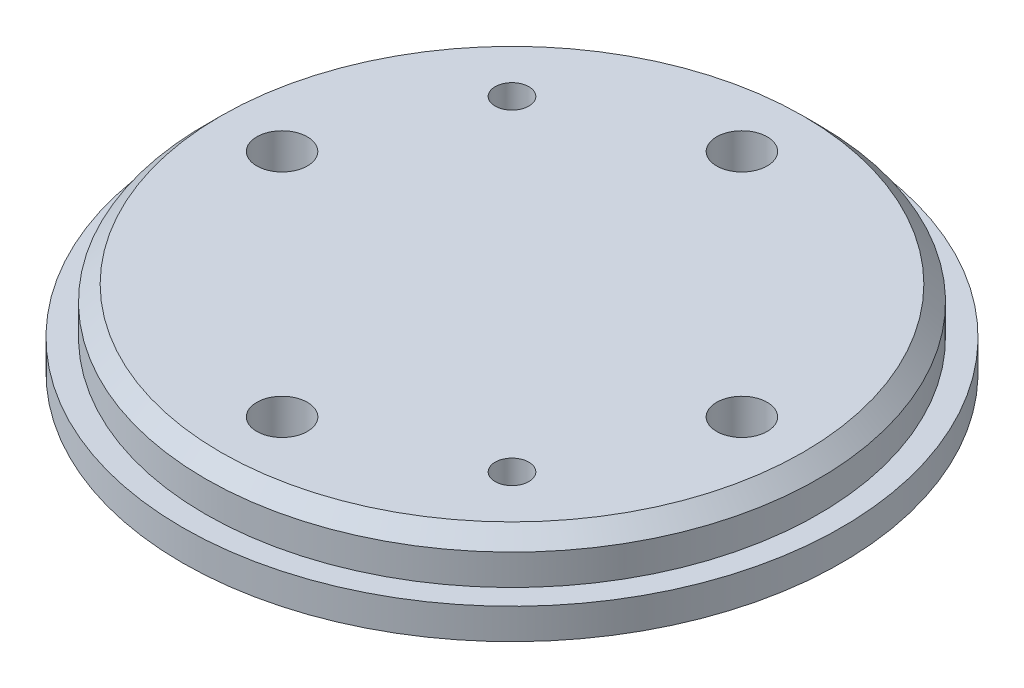
ISO-10303-21;
HEADER;
FILE_DESCRIPTION(('STEP AP214'),'2;1');
FILE_NAME('part.step','',(''),(''),'','','');
FILE_SCHEMA(('AUTOMOTIVE_DESIGN { 1 0 10303 214 1 1 1 1 }'));
ENDSEC;
DATA;
#1=APPLICATION_CONTEXT('core data for automotive mechanical design processes');
#2=APPLICATION_PROTOCOL_DEFINITION('international standard','automotive_design',2000,#1);
#3=PRODUCT_CONTEXT('',#1,'mechanical');
#4=PRODUCT('Part','Part','',(#3));
#5=PRODUCT_RELATED_PRODUCT_CATEGORY('part','',(#4));
#6=PRODUCT_DEFINITION_FORMATION('','',#4);
#7=PRODUCT_DEFINITION_CONTEXT('part definition',#1,'design');
#8=PRODUCT_DEFINITION('design','',#6,#7);
#9=PRODUCT_DEFINITION_SHAPE('','',#8);
#10=(LENGTH_UNIT() NAMED_UNIT(*) SI_UNIT(.MILLI.,.METRE.));
#11=(NAMED_UNIT(*) PLANE_ANGLE_UNIT() SI_UNIT($,.RADIAN.));
#12=(NAMED_UNIT(*) SI_UNIT($,.STERADIAN.) SOLID_ANGLE_UNIT());
#13=UNCERTAINTY_MEASURE_WITH_UNIT(LENGTH_MEASURE(1.E-05),#10,'distance_accuracy_value','');
#14=(GEOMETRIC_REPRESENTATION_CONTEXT(3) GLOBAL_UNCERTAINTY_ASSIGNED_CONTEXT((#13)) GLOBAL_UNIT_ASSIGNED_CONTEXT((#10,
#11,#12)) REPRESENTATION_CONTEXT('',''));
#15=CARTESIAN_POINT('',(0.,0.,0.));
#16=DIRECTION('',(0.,0.,1.));
#17=DIRECTION('',(1.,0.,0.));
#18=AXIS2_PLACEMENT_3D('',#15,#16,#17);
#19=CARTESIAN_POINT('',(10.6066017177982,0.,10.6066017177983));
#20=DIRECTION('',(0.,1.,0.));
#21=DIRECTION('',(0.,0.,1.));
#22=AXIS2_PLACEMENT_3D('',#19,#20,#21);
#23=CYLINDRICAL_SURFACE('',#22,1.1);
#24=CARTESIAN_POINT('',(10.6066017177982,3.,10.6066017177983));
#25=DIRECTION('',(0.,-1.,0.));
#26=DIRECTION('',(0.,0.,-1.));
#27=AXIS2_PLACEMENT_3D('',#24,#25,#26);
#28=CIRCLE('',#27,1.1);
#29=CARTESIAN_POINT('',(10.6066017177982,3.,9.50660171779826));
#30=VERTEX_POINT('',#29);
#31=EDGE_CURVE('E10',#30,#30,#28,.T.);
#32=ORIENTED_EDGE('',*,*,#31,.T.);
#33=EDGE_LOOP('',(#32));
#34=FACE_BOUND('',#33,.T.);
#35=CARTESIAN_POINT('',(10.6066017177982,5.,10.6066017177983));
#36=DIRECTION('',(0.,1.,0.));
#37=DIRECTION('',(0.,0.,-1.));
#38=AXIS2_PLACEMENT_3D('',#35,#36,#37);
#39=CIRCLE('',#38,1.1);
#40=CARTESIAN_POINT('',(10.6066017177982,5.,9.50660171779826));
#41=VERTEX_POINT('',#40);
#42=EDGE_CURVE('E111',#41,#41,#39,.T.);
#43=ORIENTED_EDGE('',*,*,#42,.T.);
#44=EDGE_LOOP('',(#43));
#45=FACE_BOUND('',#44,.T.);
#46=ADVANCED_FACE('F39',(#34,#45),#23,.F.);
#47=CARTESIAN_POINT('',(-10.6066017177982,0.,-10.6066017177983));
#48=DIRECTION('',(0.,1.,0.));
#49=DIRECTION('',(0.,0.,1.));
#50=AXIS2_PLACEMENT_3D('',#47,#48,#49);
#51=CYLINDRICAL_SURFACE('',#50,1.1);
#52=CARTESIAN_POINT('',(-10.6066017177982,3.,-10.6066017177983));
#53=DIRECTION('',(0.,-1.,0.));
#54=DIRECTION('',(0.,0.,-1.));
#55=AXIS2_PLACEMENT_3D('',#52,#53,#54);
#56=CIRCLE('',#55,1.1);
#57=CARTESIAN_POINT('',(-10.6066017177982,3.,-11.7066017177983));
#58=VERTEX_POINT('',#57);
#59=EDGE_CURVE('E46',#58,#58,#56,.T.);
#60=ORIENTED_EDGE('',*,*,#59,.T.);
#61=EDGE_LOOP('',(#60));
#62=FACE_BOUND('',#61,.T.);
#63=CARTESIAN_POINT('',(-10.6066017177982,5.,-10.6066017177983));
#64=DIRECTION('',(0.,1.,0.));
#65=DIRECTION('',(0.,0.,1.));
#66=AXIS2_PLACEMENT_3D('',#63,#64,#65);
#67=CIRCLE('',#66,1.1);
#68=CARTESIAN_POINT('',(-10.6066017177982,5.,-9.50660171779826));
#69=VERTEX_POINT('',#68);
#70=EDGE_CURVE('E100',#69,#69,#67,.T.);
#71=ORIENTED_EDGE('',*,*,#70,.T.);
#72=EDGE_LOOP('',(#71));
#73=FACE_BOUND('',#72,.T.);
#74=ADVANCED_FACE('F151',(#62,#73),#51,.F.);
#75=CARTESIAN_POINT('',(0.,2.,0.));
#76=DIRECTION('',(0.,-1.,0.));
#77=DIRECTION('',(0.,0.,-1.));
#78=AXIS2_PLACEMENT_3D('',#75,#76,#77);
#79=CYLINDRICAL_SURFACE('',#78,21.5);
#80=CARTESIAN_POINT('',(0.,2.,0.));
#81=DIRECTION('',(0.,1.,0.));
#82=DIRECTION('',(0.,0.,1.));
#83=AXIS2_PLACEMENT_3D('',#80,#81,#82);
#84=CIRCLE('',#83,21.5);
#85=CARTESIAN_POINT('',(0.,2.,21.5));
#86=VERTEX_POINT('',#85);
#87=EDGE_CURVE('E87',#86,#86,#84,.T.);
#88=ORIENTED_EDGE('',*,*,#87,.F.);
#89=EDGE_LOOP('',(#88));
#90=FACE_BOUND('',#89,.T.);
#91=CARTESIAN_POINT('',(0.,0.,0.));
#92=DIRECTION('',(0.,1.,0.));
#93=DIRECTION('',(0.,0.,1.));
#94=AXIS2_PLACEMENT_3D('',#91,#92,#93);
#95=CIRCLE('',#94,21.5);
#96=CARTESIAN_POINT('',(0.,0.,21.5));
#97=VERTEX_POINT('',#96);
#98=EDGE_CURVE('E84',#97,#97,#95,.T.);
#99=ORIENTED_EDGE('',*,*,#98,.T.);
#100=EDGE_LOOP('',(#99));
#101=FACE_BOUND('',#100,.T.);
#102=ADVANCED_FACE('F149',(#90,#101),#79,.T.);
#103=CARTESIAN_POINT('',(0.,2.,0.));
#104=DIRECTION('',(0.,1.,0.));
#105=DIRECTION('',(0.,0.,1.));
#106=AXIS2_PLACEMENT_3D('',#103,#104,#105);
#107=PLANE('',#106);
#108=CARTESIAN_POINT('',(0.,2.,0.));
#109=DIRECTION('',(0.,1.,0.));
#110=DIRECTION('',(0.,0.,1.));
#111=AXIS2_PLACEMENT_3D('',#108,#109,#110);
#112=CIRCLE('',#111,20.);
#113=CARTESIAN_POINT('',(0.,2.,20.));
#114=VERTEX_POINT('',#113);
#115=EDGE_CURVE('E83',#114,#114,#112,.T.);
#116=ORIENTED_EDGE('',*,*,#115,.F.);
#117=EDGE_LOOP('',(#116));
#118=FACE_BOUND('',#117,.T.);
#119=ORIENTED_EDGE('',*,*,#87,.T.);
#120=EDGE_LOOP('',(#119));
#121=FACE_BOUND('',#120,.T.);
#122=ADVANCED_FACE('F135',(#118,#121),#107,.T.);
#123=CARTESIAN_POINT('',(0.,0.,0.));
#124=DIRECTION('',(0.,1.,0.));
#125=DIRECTION('',(0.,0.,1.));
#126=AXIS2_PLACEMENT_3D('',#123,#124,#125);
#127=PLANE('',#126);
#128=CARTESIAN_POINT('',(10.6066017177982,0.,10.6066017177983));
#129=DIRECTION('',(0.,-1.,0.));
#130=DIRECTION('',(0.,0.,1.));
#131=AXIS2_PLACEMENT_3D('',#128,#129,#130);
#132=CIRCLE('',#131,2.1);
#133=CARTESIAN_POINT('',(10.6066017177982,0.,12.7066017177983));
#134=VERTEX_POINT('',#133);
#135=EDGE_CURVE('E117',#134,#134,#132,.T.);
#136=ORIENTED_EDGE('',*,*,#135,.F.);
#137=EDGE_LOOP('',(#136));
#138=FACE_BOUND('',#137,.T.);
#139=CARTESIAN_POINT('',(-10.6066017177982,0.,-10.6066017177983));
#140=DIRECTION('',(0.,-1.,0.));
#141=DIRECTION('',(0.,0.,-1.));
#142=AXIS2_PLACEMENT_3D('',#139,#140,#141);
#143=CIRCLE('',#142,2.1);
#144=CARTESIAN_POINT('',(-10.6066017177982,0.,-12.7066017177983));
#145=VERTEX_POINT('',#144);
#146=EDGE_CURVE('E108',#145,#145,#143,.T.);
#147=ORIENTED_EDGE('',*,*,#146,.F.);
#148=EDGE_LOOP('',(#147));
#149=FACE_BOUND('',#148,.T.);
#150=CARTESIAN_POINT('',(15.,0.,-1.57486554178151E-13));
#151=DIRECTION('',(0.,1.,0.));
#152=DIRECTION('',(0.,0.,1.));
#153=AXIS2_PLACEMENT_3D('',#150,#151,#152);
#154=CIRCLE('',#153,2.15);
#155=CARTESIAN_POINT('',(15.,0.,2.14999999999984));
#156=VERTEX_POINT('',#155);
#157=EDGE_CURVE('E54',#156,#156,#154,.T.);
#158=ORIENTED_EDGE('',*,*,#157,.T.);
#159=EDGE_LOOP('',(#158));
#160=FACE_BOUND('',#159,.T.);
#161=CARTESIAN_POINT('',(0.,0.,15.));
#162=DIRECTION('',(0.,1.,0.));
#163=DIRECTION('',(0.,0.,1.));
#164=AXIS2_PLACEMENT_3D('',#161,#162,#163);
#165=CIRCLE('',#164,2.15);
#166=CARTESIAN_POINT('',(0.,0.,17.15));
#167=VERTEX_POINT('',#166);
#168=EDGE_CURVE('E62',#167,#167,#165,.T.);
#169=ORIENTED_EDGE('',*,*,#168,.T.);
#170=EDGE_LOOP('',(#169));
#171=FACE_BOUND('',#170,.T.);
#172=CARTESIAN_POINT('',(-15.,0.,0.));
#173=DIRECTION('',(0.,1.,0.));
#174=DIRECTION('',(0.,0.,1.));
#175=AXIS2_PLACEMENT_3D('',#172,#173,#174);
#176=CIRCLE('',#175,2.15);
#177=CARTESIAN_POINT('',(-15.,0.,2.15000000000005));
#178=VERTEX_POINT('',#177);
#179=EDGE_CURVE('E68',#178,#178,#176,.T.);
#180=ORIENTED_EDGE('',*,*,#179,.T.);
#181=EDGE_LOOP('',(#180));
#182=FACE_BOUND('',#181,.T.);
#183=CARTESIAN_POINT('',(0.,0.,-15.));
#184=DIRECTION('',(0.,1.,0.));
#185=DIRECTION('',(0.,0.,1.));
#186=AXIS2_PLACEMENT_3D('',#183,#184,#185);
#187=CIRCLE('',#186,2.15);
#188=CARTESIAN_POINT('',(0.,0.,-12.85));
#189=VERTEX_POINT('',#188);
#190=EDGE_CURVE('E74',#189,#189,#187,.T.);
#191=ORIENTED_EDGE('',*,*,#190,.T.);
#192=EDGE_LOOP('',(#191));
#193=FACE_BOUND('',#192,.T.);
#194=ORIENTED_EDGE('',*,*,#98,.F.);
#195=EDGE_LOOP('',(#194));
#196=FACE_BOUND('',#195,.T.);
#197=ADVANCED_FACE('F131',(#138,#149,#160,#171,#182,#193,#196),#127,.F.);
#198=CARTESIAN_POINT('',(0.,5.,0.));
#199=DIRECTION('',(0.,-1.,0.));
#200=DIRECTION('',(0.,0.,-1.));
#201=AXIS2_PLACEMENT_3D('',#198,#199,#200);
#202=CYLINDRICAL_SURFACE('',#201,20.);
#203=CARTESIAN_POINT('',(0.,3.99999999999998,0.));
#204=DIRECTION('',(0.,1.,0.));
#205=DIRECTION('',(0.,0.,1.));
#206=AXIS2_PLACEMENT_3D('',#203,#204,#205);
#207=CIRCLE('',#206,20.);
#208=CARTESIAN_POINT('',(0.,3.99999999999998,20.));
#209=VERTEX_POINT('',#208);
#210=EDGE_CURVE('E77',#209,#209,#207,.F.);
#211=ORIENTED_EDGE('',*,*,#210,.T.);
#212=EDGE_LOOP('',(#211));
#213=FACE_BOUND('',#212,.T.);
#214=ORIENTED_EDGE('',*,*,#115,.T.);
#215=EDGE_LOOP('',(#214));
#216=FACE_BOUND('',#215,.T.);
#217=ADVANCED_FACE('F134',(#213,#216),#202,.T.);
#218=CARTESIAN_POINT('',(0.,5.,0.));
#219=DIRECTION('',(0.,1.,0.));
#220=DIRECTION('',(0.,0.,1.));
#221=AXIS2_PLACEMENT_3D('',#218,#219,#220);
#222=PLANE('',#221);
#223=ORIENTED_EDGE('',*,*,#42,.F.);
#224=EDGE_LOOP('',(#223));
#225=FACE_BOUND('',#224,.T.);
#226=ORIENTED_EDGE('',*,*,#70,.F.);
#227=EDGE_LOOP('',(#226));
#228=FACE_BOUND('',#227,.T.);
#229=CARTESIAN_POINT('',(-15.,5.,0.));
#230=DIRECTION('',(0.,1.,0.));
#231=DIRECTION('',(1.,0.,0.));
#232=AXIS2_PLACEMENT_3D('',#229,#230,#231);
#233=CIRCLE('',#232,1.65);
#234=CARTESIAN_POINT('',(-13.35,5.,0.));
#235=VERTEX_POINT('',#234);
#236=EDGE_CURVE('E95',#235,#235,#233,.T.);
#237=ORIENTED_EDGE('',*,*,#236,.F.);
#238=EDGE_LOOP('',(#237));
#239=FACE_BOUND('',#238,.T.);
#240=CARTESIAN_POINT('',(0.,5.,15.));
#241=DIRECTION('',(0.,1.,0.));
#242=DIRECTION('',(0.,0.,-1.));
#243=AXIS2_PLACEMENT_3D('',#240,#241,#242);
#244=CIRCLE('',#243,1.65);
#245=CARTESIAN_POINT('',(0.,5.,13.35));
#246=VERTEX_POINT('',#245);
#247=EDGE_CURVE('E99',#246,#246,#244,.T.);
#248=ORIENTED_EDGE('',*,*,#247,.F.);
#249=EDGE_LOOP('',(#248));
#250=FACE_BOUND('',#249,.T.);
#251=CARTESIAN_POINT('',(15.,5.,-1.57486554178151E-13));
#252=DIRECTION('',(0.,1.,0.));
#253=DIRECTION('',(-1.,0.,0.));
#254=AXIS2_PLACEMENT_3D('',#251,#252,#253);
#255=CIRCLE('',#254,1.65);
#256=CARTESIAN_POINT('',(13.35,5.,-1.40203721550878E-13));
#257=VERTEX_POINT('',#256);
#258=EDGE_CURVE('E96',#257,#257,#255,.T.);
#259=ORIENTED_EDGE('',*,*,#258,.F.);
#260=EDGE_LOOP('',(#259));
#261=FACE_BOUND('',#260,.T.);
#262=CARTESIAN_POINT('',(0.,5.,-15.));
#263=DIRECTION('',(0.,1.,0.));
#264=DIRECTION('',(0.,0.,1.));
#265=AXIS2_PLACEMENT_3D('',#262,#263,#264);
#266=CIRCLE('',#265,1.65);
#267=CARTESIAN_POINT('',(0.,5.,-13.35));
#268=VERTEX_POINT('',#267);
#269=EDGE_CURVE('E88',#268,#268,#266,.T.);
#270=ORIENTED_EDGE('',*,*,#269,.F.);
#271=EDGE_LOOP('',(#270));
#272=FACE_BOUND('',#271,.T.);
#273=CARTESIAN_POINT('',(0.,5.,0.));
#274=DIRECTION('',(0.,1.,0.));
#275=DIRECTION('',(0.,0.,1.));
#276=AXIS2_PLACEMENT_3D('',#273,#274,#275);
#277=CIRCLE('',#276,19.);
#278=CARTESIAN_POINT('',(0.,5.,19.));
#279=VERTEX_POINT('',#278);
#280=EDGE_CURVE('E80',#279,#279,#277,.T.);
#281=ORIENTED_EDGE('',*,*,#280,.T.);
#282=EDGE_LOOP('',(#281));
#283=FACE_BOUND('',#282,.T.);
#284=ADVANCED_FACE('F194',(#225,#228,#239,#250,#261,#272,#283),#222,.T.);
#285=CARTESIAN_POINT('',(0.,5.,0.));
#286=DIRECTION('',(0.,-1.,0.));
#287=DIRECTION('',(0.,0.,-1.));
#288=AXIS2_PLACEMENT_3D('',#285,#286,#287);
#289=CONICAL_SURFACE('',#288,19.,0.785398163397441);
#290=ORIENTED_EDGE('',*,*,#210,.F.);
#291=EDGE_LOOP('',(#290));
#292=FACE_BOUND('',#291,.T.);
#293=ORIENTED_EDGE('',*,*,#280,.F.);
#294=EDGE_LOOP('',(#293));
#295=FACE_BOUND('',#294,.T.);
#296=ADVANCED_FACE('F192',(#292,#295),#289,.T.);
#297=CARTESIAN_POINT('',(0.,0.,-15.));
#298=DIRECTION('',(0.,1.,0.));
#299=DIRECTION('',(0.,0.,1.));
#300=AXIS2_PLACEMENT_3D('',#297,#298,#299);
#301=CYLINDRICAL_SURFACE('',#300,1.65);
#302=CARTESIAN_POINT('',(0.,0.500000000000002,-15.));
#303=DIRECTION('',(0.,1.,0.));
#304=DIRECTION('',(0.,0.,1.));
#305=AXIS2_PLACEMENT_3D('',#302,#303,#304);
#306=CIRCLE('',#305,1.65);
#307=CARTESIAN_POINT('',(0.,0.500000000000002,-13.35));
#308=VERTEX_POINT('',#307);
#309=EDGE_CURVE('E71',#308,#308,#306,.F.);
#310=ORIENTED_EDGE('',*,*,#309,.T.);
#311=EDGE_LOOP('',(#310));
#312=FACE_BOUND('',#311,.T.);
#313=ORIENTED_EDGE('',*,*,#269,.T.);
#314=EDGE_LOOP('',(#313));
#315=FACE_BOUND('',#314,.T.);
#316=ADVANCED_FACE('F189',(#312,#315),#301,.F.);
#317=CARTESIAN_POINT('',(0.,0.,-15.));
#318=DIRECTION('',(0.,-1.,0.));
#319=DIRECTION('',(0.,0.,-1.));
#320=AXIS2_PLACEMENT_3D('',#317,#318,#319);
#321=CONICAL_SURFACE('',#320,2.15,0.785398163397445);
#322=ORIENTED_EDGE('',*,*,#309,.F.);
#323=EDGE_LOOP('',(#322));
#324=FACE_BOUND('',#323,.T.);
#325=ORIENTED_EDGE('',*,*,#190,.F.);
#326=EDGE_LOOP('',(#325));
#327=FACE_BOUND('',#326,.T.);
#328=ADVANCED_FACE('F187',(#324,#327),#321,.F.);
#329=CARTESIAN_POINT('',(15.,0.,-1.57486554178151E-13));
#330=DIRECTION('',(0.,1.,0.));
#331=DIRECTION('',(0.,0.,1.));
#332=AXIS2_PLACEMENT_3D('',#329,#330,#331);
#333=CYLINDRICAL_SURFACE('',#332,1.65);
#334=CARTESIAN_POINT('',(15.,0.500000000000002,-1.57486554178151E-13));
#335=DIRECTION('',(0.,1.,0.));
#336=DIRECTION('',(0.,0.,1.));
#337=AXIS2_PLACEMENT_3D('',#334,#335,#336);
#338=CIRCLE('',#337,1.65);
#339=CARTESIAN_POINT('',(15.,0.500000000000002,1.64999999999984));
#340=VERTEX_POINT('',#339);
#341=EDGE_CURVE('E50',#340,#340,#338,.F.);
#342=ORIENTED_EDGE('',*,*,#341,.T.);
#343=EDGE_LOOP('',(#342));
#344=FACE_BOUND('',#343,.T.);
#345=ORIENTED_EDGE('',*,*,#258,.T.);
#346=EDGE_LOOP('',(#345));
#347=FACE_BOUND('',#346,.T.);
#348=ADVANCED_FACE('F183',(#344,#347),#333,.F.);
#349=CARTESIAN_POINT('',(0.,0.,15.));
#350=DIRECTION('',(0.,1.,0.));
#351=DIRECTION('',(0.,0.,1.));
#352=AXIS2_PLACEMENT_3D('',#349,#350,#351);
#353=CYLINDRICAL_SURFACE('',#352,1.65);
#354=CARTESIAN_POINT('',(0.,0.500000000000002,15.));
#355=DIRECTION('',(0.,1.,0.));
#356=DIRECTION('',(0.,0.,1.));
#357=AXIS2_PLACEMENT_3D('',#354,#355,#356);
#358=CIRCLE('',#357,1.65);
#359=CARTESIAN_POINT('',(0.,0.500000000000002,16.65));
#360=VERTEX_POINT('',#359);
#361=EDGE_CURVE('E59',#360,#360,#358,.F.);
#362=ORIENTED_EDGE('',*,*,#361,.T.);
#363=EDGE_LOOP('',(#362));
#364=FACE_BOUND('',#363,.T.);
#365=ORIENTED_EDGE('',*,*,#247,.T.);
#366=EDGE_LOOP('',(#365));
#367=FACE_BOUND('',#366,.T.);
#368=ADVANCED_FACE('F179',(#364,#367),#353,.F.);
#369=CARTESIAN_POINT('',(-15.,0.,0.));
#370=DIRECTION('',(0.,1.,0.));
#371=DIRECTION('',(0.,0.,1.));
#372=AXIS2_PLACEMENT_3D('',#369,#370,#371);
#373=CYLINDRICAL_SURFACE('',#372,1.65);
#374=CARTESIAN_POINT('',(-15.,0.500000000000002,0.));
#375=DIRECTION('',(0.,1.,0.));
#376=DIRECTION('',(0.,0.,1.));
#377=AXIS2_PLACEMENT_3D('',#374,#375,#376);
#378=CIRCLE('',#377,1.65);
#379=CARTESIAN_POINT('',(-15.,0.500000000000002,1.65000000000005));
#380=VERTEX_POINT('',#379);
#381=EDGE_CURVE('E65',#380,#380,#378,.F.);
#382=ORIENTED_EDGE('',*,*,#381,.T.);
#383=EDGE_LOOP('',(#382));
#384=FACE_BOUND('',#383,.T.);
#385=ORIENTED_EDGE('',*,*,#236,.T.);
#386=EDGE_LOOP('',(#385));
#387=FACE_BOUND('',#386,.T.);
#388=ADVANCED_FACE('F175',(#384,#387),#373,.F.);
#389=CARTESIAN_POINT('',(-15.,0.,0.));
#390=DIRECTION('',(0.,-1.,0.));
#391=DIRECTION('',(0.,0.,-1.));
#392=AXIS2_PLACEMENT_3D('',#389,#390,#391);
#393=CONICAL_SURFACE('',#392,2.15,0.785398163397445);
#394=ORIENTED_EDGE('',*,*,#381,.F.);
#395=EDGE_LOOP('',(#394));
#396=FACE_BOUND('',#395,.T.);
#397=ORIENTED_EDGE('',*,*,#179,.F.);
#398=EDGE_LOOP('',(#397));
#399=FACE_BOUND('',#398,.T.);
#400=ADVANCED_FACE('F178',(#396,#399),#393,.F.);
#401=CARTESIAN_POINT('',(0.,0.,15.));
#402=DIRECTION('',(0.,-1.,0.));
#403=DIRECTION('',(0.,0.,-1.));
#404=AXIS2_PLACEMENT_3D('',#401,#402,#403);
#405=CONICAL_SURFACE('',#404,2.15,0.785398163397445);
#406=ORIENTED_EDGE('',*,*,#361,.F.);
#407=EDGE_LOOP('',(#406));
#408=FACE_BOUND('',#407,.T.);
#409=ORIENTED_EDGE('',*,*,#168,.F.);
#410=EDGE_LOOP('',(#409));
#411=FACE_BOUND('',#410,.T.);
#412=ADVANCED_FACE('F219',(#408,#411),#405,.F.);
#413=CARTESIAN_POINT('',(15.,0.,-1.57486554178151E-13));
#414=DIRECTION('',(0.,-1.,0.));
#415=DIRECTION('',(0.,0.,-1.));
#416=AXIS2_PLACEMENT_3D('',#413,#414,#415);
#417=CONICAL_SURFACE('',#416,2.15,0.785398163397445);
#418=ORIENTED_EDGE('',*,*,#341,.F.);
#419=EDGE_LOOP('',(#418));
#420=FACE_BOUND('',#419,.T.);
#421=ORIENTED_EDGE('',*,*,#157,.F.);
#422=EDGE_LOOP('',(#421));
#423=FACE_BOUND('',#422,.T.);
#424=ADVANCED_FACE('F172',(#420,#423),#417,.F.);
#425=CARTESIAN_POINT('',(-10.6066017177982,2.,-10.6066017177983));
#426=DIRECTION('',(0.,-1.,0.));
#427=DIRECTION('',(0.,0.,-1.));
#428=AXIS2_PLACEMENT_3D('',#425,#426,#427);
#429=CYLINDRICAL_SURFACE('',#428,2.1);
#430=CARTESIAN_POINT('',(-10.6066017177982,2.,-10.6066017177983));
#431=DIRECTION('',(0.,-1.,0.));
#432=DIRECTION('',(0.,0.,-1.));
#433=AXIS2_PLACEMENT_3D('',#430,#431,#432);
#434=CIRCLE('',#433,2.1);
#435=CARTESIAN_POINT('',(-10.6066017177982,2.,-12.7066017177983));
#436=VERTEX_POINT('',#435);
#437=EDGE_CURVE('E107',#436,#436,#434,.T.);
#438=ORIENTED_EDGE('',*,*,#437,.F.);
#439=EDGE_LOOP('',(#438));
#440=FACE_BOUND('',#439,.T.);
#441=ORIENTED_EDGE('',*,*,#146,.T.);
#442=EDGE_LOOP('',(#441));
#443=FACE_BOUND('',#442,.T.);
#444=ADVANCED_FACE('F170',(#440,#443),#429,.F.);
#445=CARTESIAN_POINT('',(-10.6066017177982,2.,-10.6066017177983));
#446=DIRECTION('',(0.,-1.,0.));
#447=DIRECTION('',(0.,0.,-1.));
#448=AXIS2_PLACEMENT_3D('',#445,#446,#447);
#449=CONICAL_SURFACE('',#448,2.1,0.785398163397446);
#450=ORIENTED_EDGE('',*,*,#59,.F.);
#451=EDGE_LOOP('',(#450));
#452=FACE_BOUND('',#451,.T.);
#453=ORIENTED_EDGE('',*,*,#437,.T.);
#454=EDGE_LOOP('',(#453));
#455=FACE_BOUND('',#454,.T.);
#456=ADVANCED_FACE('F127',(#452,#455),#449,.F.);
#457=CARTESIAN_POINT('',(10.6066017177982,2.,10.6066017177983));
#458=DIRECTION('',(0.,-1.,0.));
#459=DIRECTION('',(0.,0.,-1.));
#460=AXIS2_PLACEMENT_3D('',#457,#458,#459);
#461=CYLINDRICAL_SURFACE('',#460,2.1);
#462=CARTESIAN_POINT('',(10.6066017177982,2.,10.6066017177983));
#463=DIRECTION('',(0.,-1.,0.));
#464=DIRECTION('',(0.,0.,1.));
#465=AXIS2_PLACEMENT_3D('',#462,#463,#464);
#466=CIRCLE('',#465,2.1);
#467=CARTESIAN_POINT('',(10.6066017177982,2.,12.7066017177983));
#468=VERTEX_POINT('',#467);
#469=EDGE_CURVE('E116',#468,#468,#466,.T.);
#470=ORIENTED_EDGE('',*,*,#469,.F.);
#471=EDGE_LOOP('',(#470));
#472=FACE_BOUND('',#471,.T.);
#473=ORIENTED_EDGE('',*,*,#135,.T.);
#474=EDGE_LOOP('',(#473));
#475=FACE_BOUND('',#474,.T.);
#476=ADVANCED_FACE('F124',(#472,#475),#461,.F.);
#477=CARTESIAN_POINT('',(10.6066017177982,2.,10.6066017177983));
#478=DIRECTION('',(0.,-1.,0.));
#479=DIRECTION('',(0.,0.,-1.));
#480=AXIS2_PLACEMENT_3D('',#477,#478,#479);
#481=CONICAL_SURFACE('',#480,2.1,0.785398163397446);
#482=ORIENTED_EDGE('',*,*,#31,.F.);
#483=EDGE_LOOP('',(#482));
#484=FACE_BOUND('',#483,.T.);
#485=ORIENTED_EDGE('',*,*,#469,.T.);
#486=EDGE_LOOP('',(#485));
#487=FACE_BOUND('',#486,.T.);
#488=ADVANCED_FACE('F41',(#484,#487),#481,.F.);
#489=CLOSED_SHELL('',(#46,#74,#102,#122,#197,#217,#284,#296,#316,#328,#348,#368,#388,#400,#412,
#424,#444,#456,#476,#488));
#490=MANIFOLD_SOLID_BREP('B2',#489);
#491=ADVANCED_BREP_SHAPE_REPRESENTATION('',(#18,#490),#14);
#492=SHAPE_DEFINITION_REPRESENTATION(#9,#491);
ENDSEC;
END-ISO-10303-21;
